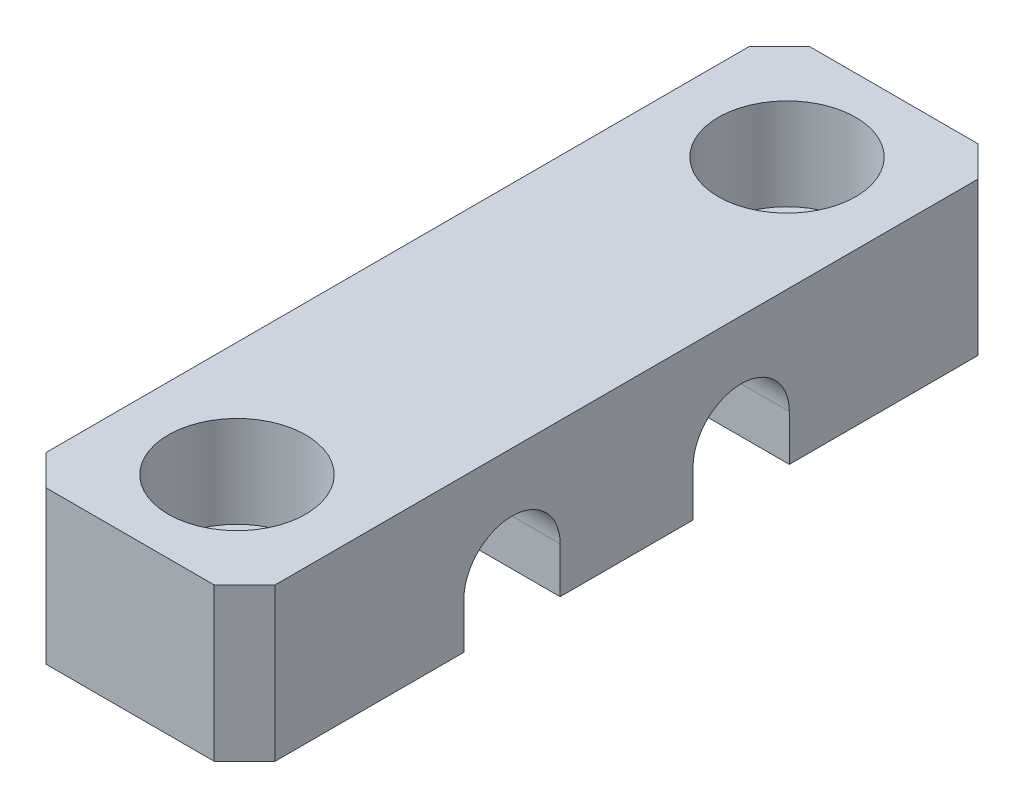
ISO-10303-21;
HEADER;
FILE_DESCRIPTION(('STEP AP214'),'2;1');
FILE_NAME('part.step','',(''),(''),'','','');
FILE_SCHEMA(('AUTOMOTIVE_DESIGN { 1 0 10303 214 1 1 1 1 }'));
ENDSEC;
DATA;
#1=APPLICATION_CONTEXT('core data for automotive mechanical design processes');
#2=APPLICATION_PROTOCOL_DEFINITION('international standard','automotive_design',2000,#1);
#3=PRODUCT_CONTEXT('',#1,'mechanical');
#4=PRODUCT('Part','Part','',(#3));
#5=PRODUCT_RELATED_PRODUCT_CATEGORY('part','',(#4));
#6=PRODUCT_DEFINITION_FORMATION('','',#4);
#7=PRODUCT_DEFINITION_CONTEXT('part definition',#1,'design');
#8=PRODUCT_DEFINITION('design','',#6,#7);
#9=PRODUCT_DEFINITION_SHAPE('','',#8);
#10=(LENGTH_UNIT() NAMED_UNIT(*) SI_UNIT(.MILLI.,.METRE.));
#11=(NAMED_UNIT(*) PLANE_ANGLE_UNIT() SI_UNIT($,.RADIAN.));
#12=(NAMED_UNIT(*) SI_UNIT($,.STERADIAN.) SOLID_ANGLE_UNIT());
#13=UNCERTAINTY_MEASURE_WITH_UNIT(LENGTH_MEASURE(1.E-05),#10,'distance_accuracy_value','');
#14=(GEOMETRIC_REPRESENTATION_CONTEXT(3) GLOBAL_UNCERTAINTY_ASSIGNED_CONTEXT((#13)) GLOBAL_UNIT_ASSIGNED_CONTEXT((#10,
#11,#12)) REPRESENTATION_CONTEXT('',''));
#15=CARTESIAN_POINT('',(0.,0.,0.));
#16=DIRECTION('',(0.,0.,1.));
#17=DIRECTION('',(1.,0.,0.));
#18=AXIS2_PLACEMENT_3D('',#15,#16,#17);
#19=CARTESIAN_POINT('',(15.,-5.,25.));
#20=DIRECTION('',(0.,1.,0.));
#21=DIRECTION('',(0.,0.,1.));
#22=AXIS2_PLACEMENT_3D('',#19,#20,#21);
#23=PLANE('',#22);
#24=CARTESIAN_POINT('',(7.49999999999999,-5.,-18.));
#25=DIRECTION('',(0.,1.,0.));
#26=DIRECTION('',(0.,0.,1.));
#27=AXIS2_PLACEMENT_3D('',#24,#25,#26);
#28=CIRCLE('',#27,3.);
#29=CARTESIAN_POINT('',(7.49999999999999,-5.,-15.));
#30=VERTEX_POINT('',#29);
#31=EDGE_CURVE('E258',#30,#30,#28,.T.);
#32=ORIENTED_EDGE('',*,*,#31,.T.);
#33=EDGE_LOOP('',(#32));
#34=FACE_BOUND('',#33,.T.);
#35=DIRECTION('',(0.,0.,-1.));
#36=VECTOR('',#35,1.);
#37=CARTESIAN_POINT('',(0.,-5.,25.));
#38=LINE('',#37,#36);
#39=CARTESIAN_POINT('',(0.,-5.,-10.65));
#40=VERTEX_POINT('',#39);
#41=CARTESIAN_POINT('',(0.,-5.,-23.));
#42=VERTEX_POINT('',#41);
#43=EDGE_CURVE('E161',#40,#42,#38,.T.);
#44=ORIENTED_EDGE('',*,*,#43,.T.);
#45=DIRECTION('',(-0.707106781186548,0.,0.707106781186548));
#46=VECTOR('',#45,1.);
#47=CARTESIAN_POINT('',(2.,-5.,-25.));
#48=LINE('',#47,#46);
#49=CARTESIAN_POINT('',(2.00000000000001,-5.,-25.));
#50=VERTEX_POINT('',#49);
#51=EDGE_CURVE('E11',#42,#50,#48,.F.);
#52=ORIENTED_EDGE('',*,*,#51,.T.);
#53=DIRECTION('',(-1.,0.,0.));
#54=VECTOR('',#53,1.);
#55=CARTESIAN_POINT('',(15.,-5.,-25.));
#56=LINE('',#55,#54);
#57=CARTESIAN_POINT('',(13.,-5.,-25.));
#58=VERTEX_POINT('',#57);
#59=EDGE_CURVE('E197',#58,#50,#56,.T.);
#60=ORIENTED_EDGE('',*,*,#59,.F.);
#61=DIRECTION('',(0.707106781186548,0.,0.707106781186548));
#62=VECTOR('',#61,1.);
#63=CARTESIAN_POINT('',(15.,-5.,-23.));
#64=LINE('',#63,#62);
#65=CARTESIAN_POINT('',(15.,-5.,-23.));
#66=VERTEX_POINT('',#65);
#67=EDGE_CURVE('E42',#58,#66,#64,.T.);
#68=ORIENTED_EDGE('',*,*,#67,.T.);
#69=DIRECTION('',(0.,0.,-1.));
#70=VECTOR('',#69,1.);
#71=CARTESIAN_POINT('',(15.,-5.,25.));
#72=LINE('',#71,#70);
#73=CARTESIAN_POINT('',(15.,-5.,-10.65));
#74=VERTEX_POINT('',#73);
#75=EDGE_CURVE('E163',#74,#66,#72,.T.);
#76=ORIENTED_EDGE('',*,*,#75,.F.);
#77=DIRECTION('',(1.,0.,0.));
#78=VECTOR('',#77,1.);
#79=CARTESIAN_POINT('',(0.,-5.,-10.65));
#80=LINE('',#79,#78);
#81=EDGE_CURVE('E151',#40,#74,#80,.T.);
#82=ORIENTED_EDGE('',*,*,#81,.F.);
#83=EDGE_LOOP('',(#44,#52,#60,#68,#76,#82));
#84=FACE_BOUND('',#83,.T.);
#85=ADVANCED_FACE('F34',(#34,#84),#23,.F.);
#86=CARTESIAN_POINT('',(0.,-5.,4.35));
#87=VERTEX_POINT('',#86);
#88=CARTESIAN_POINT('',(0.,-5.,-4.35));
#89=VERTEX_POINT('',#88);
#90=EDGE_CURVE('E171',#87,#89,#38,.T.);
#91=ORIENTED_EDGE('',*,*,#90,.T.);
#92=DIRECTION('',(1.,0.,0.));
#93=VECTOR('',#92,1.);
#94=CARTESIAN_POINT('',(0.,-5.,-4.35));
#95=LINE('',#94,#93);
#96=CARTESIAN_POINT('',(15.,-5.,-4.35));
#97=VERTEX_POINT('',#96);
#98=EDGE_CURVE('E217',#89,#97,#95,.T.);
#99=ORIENTED_EDGE('',*,*,#98,.T.);
#100=CARTESIAN_POINT('',(15.,-5.,4.35));
#101=VERTEX_POINT('',#100);
#102=EDGE_CURVE('E191',#101,#97,#72,.T.);
#103=ORIENTED_EDGE('',*,*,#102,.F.);
#104=DIRECTION('',(1.,0.,0.));
#105=VECTOR('',#104,1.);
#106=CARTESIAN_POINT('',(15.,-5.,4.35));
#107=LINE('',#106,#105);
#108=EDGE_CURVE('E215',#87,#101,#107,.T.);
#109=ORIENTED_EDGE('',*,*,#108,.F.);
#110=EDGE_LOOP('',(#91,#99,#103,#109));
#111=FACE_BOUND('',#110,.T.);
#112=ADVANCED_FACE('F214',(#111),#23,.F.);
#113=CARTESIAN_POINT('',(7.5,-5.,18.));
#114=DIRECTION('',(0.,1.,0.));
#115=DIRECTION('',(0.,0.,1.));
#116=AXIS2_PLACEMENT_3D('',#113,#114,#115);
#117=CIRCLE('',#116,3.);
#118=CARTESIAN_POINT('',(7.5,-5.,21.));
#119=VERTEX_POINT('',#118);
#120=EDGE_CURVE('E252',#119,#119,#117,.T.);
#121=ORIENTED_EDGE('',*,*,#120,.T.);
#122=EDGE_LOOP('',(#121));
#123=FACE_BOUND('',#122,.T.);
#124=DIRECTION('',(-1.,0.,0.));
#125=VECTOR('',#124,1.);
#126=CARTESIAN_POINT('',(15.,-5.,25.));
#127=LINE('',#126,#125);
#128=CARTESIAN_POINT('',(13.,-5.,25.));
#129=VERTEX_POINT('',#128);
#130=CARTESIAN_POINT('',(2.00000000000001,-5.,25.));
#131=VERTEX_POINT('',#130);
#132=EDGE_CURVE('E201',#129,#131,#127,.T.);
#133=ORIENTED_EDGE('',*,*,#132,.T.);
#134=DIRECTION('',(0.707106781186548,0.,0.707106781186548));
#135=VECTOR('',#134,1.);
#136=CARTESIAN_POINT('',(2.,-5.,25.));
#137=LINE('',#136,#135);
#138=CARTESIAN_POINT('',(0.,-5.,23.));
#139=VERTEX_POINT('',#138);
#140=EDGE_CURVE('E315',#131,#139,#137,.F.);
#141=ORIENTED_EDGE('',*,*,#140,.T.);
#142=CARTESIAN_POINT('',(0.,-5.,10.65));
#143=VERTEX_POINT('',#142);
#144=EDGE_CURVE('E174',#139,#143,#38,.T.);
#145=ORIENTED_EDGE('',*,*,#144,.T.);
#146=DIRECTION('',(1.,0.,0.));
#147=VECTOR('',#146,1.);
#148=CARTESIAN_POINT('',(15.,-5.,10.65));
#149=LINE('',#148,#147);
#150=CARTESIAN_POINT('',(15.,-5.,10.65));
#151=VERTEX_POINT('',#150);
#152=EDGE_CURVE('E245',#143,#151,#149,.T.);
#153=ORIENTED_EDGE('',*,*,#152,.T.);
#154=CARTESIAN_POINT('',(15.,-5.,23.));
#155=VERTEX_POINT('',#154);
#156=EDGE_CURVE('E193',#155,#151,#72,.T.);
#157=ORIENTED_EDGE('',*,*,#156,.F.);
#158=DIRECTION('',(-0.707106781186548,0.,0.707106781186548));
#159=VECTOR('',#158,1.);
#160=CARTESIAN_POINT('',(15.,-5.,23.));
#161=LINE('',#160,#159);
#162=EDGE_CURVE('E317',#155,#129,#161,.T.);
#163=ORIENTED_EDGE('',*,*,#162,.T.);
#164=EDGE_LOOP('',(#133,#141,#145,#153,#157,#163));
#165=FACE_BOUND('',#164,.T.);
#166=ADVANCED_FACE('F328',(#123,#165),#23,.F.);
#167=CARTESIAN_POINT('',(15.,0.,0.));
#168=DIRECTION('',(1.,0.,0.));
#169=DIRECTION('',(0.,0.,-1.));
#170=AXIS2_PLACEMENT_3D('',#167,#168,#169);
#171=PLANE('',#170);
#172=DIRECTION('',(0.,0.,1.));
#173=VECTOR('',#172,1.);
#174=CARTESIAN_POINT('',(15.,5.,25.));
#175=LINE('',#174,#173);
#176=CARTESIAN_POINT('',(15.,5.,-23.));
#177=VERTEX_POINT('',#176);
#178=CARTESIAN_POINT('',(15.,5.,23.));
#179=VERTEX_POINT('',#178);
#180=EDGE_CURVE('E180',#177,#179,#175,.T.);
#181=ORIENTED_EDGE('',*,*,#180,.T.);
#182=DIRECTION('',(0.,-1.,0.));
#183=VECTOR('',#182,1.);
#184=CARTESIAN_POINT('',(15.,-5.,23.));
#185=LINE('',#184,#183);
#186=EDGE_CURVE('E297',#179,#155,#185,.T.);
#187=ORIENTED_EDGE('',*,*,#186,.T.);
#188=ORIENTED_EDGE('',*,*,#156,.T.);
#189=DIRECTION('',(0.,-1.,0.));
#190=VECTOR('',#189,1.);
#191=CARTESIAN_POINT('',(15.,0.,10.65));
#192=LINE('',#191,#190);
#193=CARTESIAN_POINT('',(15.,-2.,10.65));
#194=VERTEX_POINT('',#193);
#195=EDGE_CURVE('E233',#194,#151,#192,.T.);
#196=ORIENTED_EDGE('',*,*,#195,.F.);
#197=CARTESIAN_POINT('',(15.,-2.,7.5));
#198=DIRECTION('',(1.,0.,0.));
#199=DIRECTION('',(0.,0.,-1.));
#200=AXIS2_PLACEMENT_3D('',#197,#198,#199);
#201=CIRCLE('',#200,3.15);
#202=CARTESIAN_POINT('',(15.,-2.,4.35));
#203=VERTEX_POINT('',#202);
#204=EDGE_CURVE('E223',#203,#194,#201,.T.);
#205=ORIENTED_EDGE('',*,*,#204,.F.);
#206=DIRECTION('',(0.,-1.,0.));
#207=VECTOR('',#206,1.);
#208=CARTESIAN_POINT('',(15.,0.,4.35));
#209=LINE('',#208,#207);
#210=EDGE_CURVE('E210',#203,#101,#209,.T.);
#211=ORIENTED_EDGE('',*,*,#210,.T.);
#212=ORIENTED_EDGE('',*,*,#102,.T.);
#213=DIRECTION('',(0.,-1.,0.));
#214=VECTOR('',#213,1.);
#215=CARTESIAN_POINT('',(15.,0.,-4.35));
#216=LINE('',#215,#214);
#217=CARTESIAN_POINT('',(15.,-2.,-4.35));
#218=VERTEX_POINT('',#217);
#219=EDGE_CURVE('E158',#218,#97,#216,.T.);
#220=ORIENTED_EDGE('',*,*,#219,.F.);
#221=CARTESIAN_POINT('',(15.,-2.,-7.5));
#222=DIRECTION('',(1.,0.,0.));
#223=DIRECTION('',(0.,0.,-1.));
#224=AXIS2_PLACEMENT_3D('',#221,#222,#223);
#225=CIRCLE('',#224,3.15);
#226=CARTESIAN_POINT('',(15.,-2.,-10.65));
#227=VERTEX_POINT('',#226);
#228=EDGE_CURVE('E558',#227,#218,#225,.T.);
#229=ORIENTED_EDGE('',*,*,#228,.F.);
#230=DIRECTION('',(0.,-1.,0.));
#231=VECTOR('',#230,1.);
#232=CARTESIAN_POINT('',(15.,0.,-10.65));
#233=LINE('',#232,#231);
#234=EDGE_CURVE('E309',#227,#74,#233,.T.);
#235=ORIENTED_EDGE('',*,*,#234,.T.);
#236=ORIENTED_EDGE('',*,*,#75,.T.);
#237=DIRECTION('',(0.,1.,0.));
#238=VECTOR('',#237,1.);
#239=CARTESIAN_POINT('',(15.,5.,-23.));
#240=LINE('',#239,#238);
#241=EDGE_CURVE('E294',#66,#177,#240,.T.);
#242=ORIENTED_EDGE('',*,*,#241,.T.);
#243=EDGE_LOOP('',(#181,#187,#188,#196,#205,#211,#212,#220,#229,#235,#236,#242));
#244=FACE_BOUND('',#243,.T.);
#245=ADVANCED_FACE('F206',(#244),#171,.T.);
#246=CARTESIAN_POINT('',(0.,0.,0.));
#247=DIRECTION('',(1.,0.,0.));
#248=DIRECTION('',(0.,0.,-1.));
#249=AXIS2_PLACEMENT_3D('',#246,#247,#248);
#250=PLANE('',#249);
#251=ORIENTED_EDGE('',*,*,#144,.F.);
#252=DIRECTION('',(0.,1.,0.));
#253=VECTOR('',#252,1.);
#254=CARTESIAN_POINT('',(0.,0.,23.));
#255=LINE('',#254,#253);
#256=CARTESIAN_POINT('',(0.,5.,23.));
#257=VERTEX_POINT('',#256);
#258=EDGE_CURVE('E291',#139,#257,#255,.T.);
#259=ORIENTED_EDGE('',*,*,#258,.T.);
#260=DIRECTION('',(0.,0.,1.));
#261=VECTOR('',#260,1.);
#262=CARTESIAN_POINT('',(0.,5.,25.));
#263=LINE('',#262,#261);
#264=CARTESIAN_POINT('',(0.,5.,-23.));
#265=VERTEX_POINT('',#264);
#266=EDGE_CURVE('E172',#265,#257,#263,.T.);
#267=ORIENTED_EDGE('',*,*,#266,.F.);
#268=DIRECTION('',(0.,-1.,0.));
#269=VECTOR('',#268,1.);
#270=CARTESIAN_POINT('',(0.,0.,-23.));
#271=LINE('',#270,#269);
#272=EDGE_CURVE('E170',#265,#42,#271,.T.);
#273=ORIENTED_EDGE('',*,*,#272,.T.);
#274=ORIENTED_EDGE('',*,*,#43,.F.);
#275=DIRECTION('',(0.,-1.,0.));
#276=VECTOR('',#275,1.);
#277=CARTESIAN_POINT('',(0.,0.,-10.65));
#278=LINE('',#277,#276);
#279=CARTESIAN_POINT('',(0.,-2.,-10.65));
#280=VERTEX_POINT('',#279);
#281=EDGE_CURVE('E147',#280,#40,#278,.T.);
#282=ORIENTED_EDGE('',*,*,#281,.F.);
#283=CARTESIAN_POINT('',(0.,-2.,-7.5));
#284=DIRECTION('',(1.,0.,0.));
#285=DIRECTION('',(0.,0.,-1.));
#286=AXIS2_PLACEMENT_3D('',#283,#284,#285);
#287=CIRCLE('',#286,3.15);
#288=CARTESIAN_POINT('',(0.,-2.,-4.35));
#289=VERTEX_POINT('',#288);
#290=EDGE_CURVE('E157',#280,#289,#287,.T.);
#291=ORIENTED_EDGE('',*,*,#290,.T.);
#292=DIRECTION('',(0.,-1.,0.));
#293=VECTOR('',#292,1.);
#294=CARTESIAN_POINT('',(0.,0.,-4.35));
#295=LINE('',#294,#293);
#296=EDGE_CURVE('E164',#289,#89,#295,.T.);
#297=ORIENTED_EDGE('',*,*,#296,.T.);
#298=ORIENTED_EDGE('',*,*,#90,.F.);
#299=DIRECTION('',(0.,-1.,0.));
#300=VECTOR('',#299,1.);
#301=CARTESIAN_POINT('',(0.,0.,4.35));
#302=LINE('',#301,#300);
#303=CARTESIAN_POINT('',(0.,-2.,4.35));
#304=VERTEX_POINT('',#303);
#305=EDGE_CURVE('E230',#304,#87,#302,.T.);
#306=ORIENTED_EDGE('',*,*,#305,.F.);
#307=CARTESIAN_POINT('',(0.,-2.,7.5));
#308=DIRECTION('',(1.,0.,0.));
#309=DIRECTION('',(0.,0.,-1.));
#310=AXIS2_PLACEMENT_3D('',#307,#308,#309);
#311=CIRCLE('',#310,3.15);
#312=CARTESIAN_POINT('',(0.,-2.,10.65));
#313=VERTEX_POINT('',#312);
#314=EDGE_CURVE('E232',#304,#313,#311,.T.);
#315=ORIENTED_EDGE('',*,*,#314,.T.);
#316=DIRECTION('',(0.,-1.,0.));
#317=VECTOR('',#316,1.);
#318=CARTESIAN_POINT('',(0.,0.,10.65));
#319=LINE('',#318,#317);
#320=EDGE_CURVE('E236',#313,#143,#319,.T.);
#321=ORIENTED_EDGE('',*,*,#320,.T.);
#322=EDGE_LOOP('',(#251,#259,#267,#273,#274,#282,#291,#297,#298,#306,#315,#321));
#323=FACE_BOUND('',#322,.T.);
#324=ADVANCED_FACE('F167',(#323),#250,.F.);
#325=CARTESIAN_POINT('',(15.,5.,-25.));
#326=DIRECTION('',(0.,0.,1.));
#327=DIRECTION('',(1.,0.,0.));
#328=AXIS2_PLACEMENT_3D('',#325,#326,#327);
#329=PLANE('',#328);
#330=ORIENTED_EDGE('',*,*,#59,.T.);
#331=DIRECTION('',(0.,1.,0.));
#332=VECTOR('',#331,1.);
#333=CARTESIAN_POINT('',(2.,5.,-25.));
#334=LINE('',#333,#332);
#335=CARTESIAN_POINT('',(2.00000000000001,5.,-25.));
#336=VERTEX_POINT('',#335);
#337=EDGE_CURVE('E304',#50,#336,#334,.T.);
#338=ORIENTED_EDGE('',*,*,#337,.T.);
#339=DIRECTION('',(-1.,0.,0.));
#340=VECTOR('',#339,1.);
#341=CARTESIAN_POINT('',(15.,5.,-25.));
#342=LINE('',#341,#340);
#343=CARTESIAN_POINT('',(13.,5.,-25.));
#344=VERTEX_POINT('',#343);
#345=EDGE_CURVE('E322',#344,#336,#342,.T.);
#346=ORIENTED_EDGE('',*,*,#345,.F.);
#347=DIRECTION('',(0.,-1.,0.));
#348=VECTOR('',#347,1.);
#349=CARTESIAN_POINT('',(13.,-5.,-25.));
#350=LINE('',#349,#348);
#351=EDGE_CURVE('E54',#344,#58,#350,.T.);
#352=ORIENTED_EDGE('',*,*,#351,.T.);
#353=EDGE_LOOP('',(#330,#338,#346,#352));
#354=FACE_BOUND('',#353,.T.);
#355=ADVANCED_FACE('F278',(#354),#329,.F.);
#356=CARTESIAN_POINT('',(15.,5.,25.));
#357=DIRECTION('',(0.,-1.,0.));
#358=DIRECTION('',(0.,0.,-1.));
#359=AXIS2_PLACEMENT_3D('',#356,#357,#358);
#360=PLANE('',#359);
#361=CARTESIAN_POINT('',(7.49999999999999,5.,-18.));
#362=DIRECTION('',(0.,1.,0.));
#363=DIRECTION('',(0.,0.,1.));
#364=AXIS2_PLACEMENT_3D('',#361,#362,#363);
#365=CIRCLE('',#364,4.5);
#366=CARTESIAN_POINT('',(7.49999999999999,5.,-13.5));
#367=VERTEX_POINT('',#366);
#368=EDGE_CURVE('E261',#367,#367,#365,.T.);
#369=ORIENTED_EDGE('',*,*,#368,.F.);
#370=EDGE_LOOP('',(#369));
#371=FACE_BOUND('',#370,.T.);
#372=CARTESIAN_POINT('',(7.5,5.,18.));
#373=DIRECTION('',(0.,1.,0.));
#374=DIRECTION('',(0.,0.,1.));
#375=AXIS2_PLACEMENT_3D('',#372,#373,#374);
#376=CIRCLE('',#375,4.5);
#377=CARTESIAN_POINT('',(7.5,5.,22.5));
#378=VERTEX_POINT('',#377);
#379=EDGE_CURVE('E195',#378,#378,#376,.T.);
#380=ORIENTED_EDGE('',*,*,#379,.F.);
#381=EDGE_LOOP('',(#380));
#382=FACE_BOUND('',#381,.T.);
#383=ORIENTED_EDGE('',*,*,#266,.T.);
#384=DIRECTION('',(-0.707106781186548,0.,-0.707106781186548));
#385=VECTOR('',#384,1.);
#386=CARTESIAN_POINT('',(2.,5.,25.));
#387=LINE('',#386,#385);
#388=CARTESIAN_POINT('',(2.00000000000001,5.,25.));
#389=VERTEX_POINT('',#388);
#390=EDGE_CURVE('E283',#257,#389,#387,.F.);
#391=ORIENTED_EDGE('',*,*,#390,.T.);
#392=DIRECTION('',(-1.,0.,0.));
#393=VECTOR('',#392,1.);
#394=CARTESIAN_POINT('',(15.,5.,25.));
#395=LINE('',#394,#393);
#396=CARTESIAN_POINT('',(13.,5.,25.));
#397=VERTEX_POINT('',#396);
#398=EDGE_CURVE('E324',#397,#389,#395,.T.);
#399=ORIENTED_EDGE('',*,*,#398,.F.);
#400=DIRECTION('',(0.707106781186548,0.,-0.707106781186548));
#401=VECTOR('',#400,1.);
#402=CARTESIAN_POINT('',(15.,5.,23.));
#403=LINE('',#402,#401);
#404=EDGE_CURVE('E295',#397,#179,#403,.T.);
#405=ORIENTED_EDGE('',*,*,#404,.T.);
#406=ORIENTED_EDGE('',*,*,#180,.F.);
#407=DIRECTION('',(-0.707106781186548,0.,-0.707106781186548));
#408=VECTOR('',#407,1.);
#409=CARTESIAN_POINT('',(15.,5.,-23.));
#410=LINE('',#409,#408);
#411=EDGE_CURVE('E310',#177,#344,#410,.T.);
#412=ORIENTED_EDGE('',*,*,#411,.T.);
#413=ORIENTED_EDGE('',*,*,#345,.T.);
#414=DIRECTION('',(0.707106781186548,0.,-0.707106781186548));
#415=VECTOR('',#414,1.);
#416=CARTESIAN_POINT('',(2.,5.,-25.));
#417=LINE('',#416,#415);
#418=EDGE_CURVE('E286',#336,#265,#417,.F.);
#419=ORIENTED_EDGE('',*,*,#418,.T.);
#420=EDGE_LOOP('',(#383,#391,#399,#405,#406,#412,#413,#419));
#421=FACE_BOUND('',#420,.T.);
#422=ADVANCED_FACE('F274',(#371,#382,#421),#360,.F.);
#423=CARTESIAN_POINT('',(15.,5.,25.));
#424=DIRECTION('',(0.,0.,-1.));
#425=DIRECTION('',(-1.,0.,0.));
#426=AXIS2_PLACEMENT_3D('',#423,#424,#425);
#427=PLANE('',#426);
#428=ORIENTED_EDGE('',*,*,#398,.T.);
#429=DIRECTION('',(0.,-1.,0.));
#430=VECTOR('',#429,1.);
#431=CARTESIAN_POINT('',(2.,5.,25.));
#432=LINE('',#431,#430);
#433=EDGE_CURVE('E293',#389,#131,#432,.T.);
#434=ORIENTED_EDGE('',*,*,#433,.T.);
#435=ORIENTED_EDGE('',*,*,#132,.F.);
#436=DIRECTION('',(0.,1.,0.));
#437=VECTOR('',#436,1.);
#438=CARTESIAN_POINT('',(13.,5.,25.));
#439=LINE('',#438,#437);
#440=EDGE_CURVE('E320',#129,#397,#439,.T.);
#441=ORIENTED_EDGE('',*,*,#440,.T.);
#442=EDGE_LOOP('',(#428,#434,#435,#441));
#443=FACE_BOUND('',#442,.T.);
#444=ADVANCED_FACE('F277',(#443),#427,.F.);
#445=CARTESIAN_POINT('',(7.5,-1.,18.));
#446=DIRECTION('',(0.,1.,0.));
#447=DIRECTION('',(0.,0.,1.));
#448=AXIS2_PLACEMENT_3D('',#445,#446,#447);
#449=CYLINDRICAL_SURFACE('',#448,4.5);
#450=CARTESIAN_POINT('',(7.5,-1.,18.));
#451=DIRECTION('',(0.,1.,0.));
#452=DIRECTION('',(0.,0.,1.));
#453=AXIS2_PLACEMENT_3D('',#450,#451,#452);
#454=CIRCLE('',#453,4.5);
#455=CARTESIAN_POINT('',(7.5,-1.,22.5));
#456=VERTEX_POINT('',#455);
#457=EDGE_CURVE('E177',#456,#456,#454,.T.);
#458=ORIENTED_EDGE('',*,*,#457,.F.);
#459=EDGE_LOOP('',(#458));
#460=FACE_BOUND('',#459,.T.);
#461=ORIENTED_EDGE('',*,*,#379,.T.);
#462=EDGE_LOOP('',(#461));
#463=FACE_BOUND('',#462,.T.);
#464=ADVANCED_FACE('F272',(#460,#463),#449,.F.);
#465=CARTESIAN_POINT('',(7.5,-1.,18.));
#466=DIRECTION('',(0.,1.,0.));
#467=DIRECTION('',(0.,0.,1.));
#468=AXIS2_PLACEMENT_3D('',#465,#466,#467);
#469=PLANE('',#468);
#470=CARTESIAN_POINT('',(7.5,-1.,18.));
#471=DIRECTION('',(0.,1.,0.));
#472=DIRECTION('',(0.,0.,1.));
#473=AXIS2_PLACEMENT_3D('',#470,#471,#472);
#474=CIRCLE('',#473,3.);
#475=CARTESIAN_POINT('',(7.5,-1.,21.));
#476=VERTEX_POINT('',#475);
#477=EDGE_CURVE('E249',#476,#476,#474,.T.);
#478=ORIENTED_EDGE('',*,*,#477,.F.);
#479=EDGE_LOOP('',(#478));
#480=FACE_BOUND('',#479,.T.);
#481=ORIENTED_EDGE('',*,*,#457,.T.);
#482=EDGE_LOOP('',(#481));
#483=FACE_BOUND('',#482,.T.);
#484=ADVANCED_FACE('F377',(#480,#483),#469,.T.);
#485=CARTESIAN_POINT('',(7.49999999999999,-1.,-18.));
#486=DIRECTION('',(0.,1.,0.));
#487=DIRECTION('',(0.,0.,1.));
#488=AXIS2_PLACEMENT_3D('',#485,#486,#487);
#489=CYLINDRICAL_SURFACE('',#488,4.5);
#490=CARTESIAN_POINT('',(7.49999999999999,-1.,-18.));
#491=DIRECTION('',(0.,1.,0.));
#492=DIRECTION('',(0.,0.,1.));
#493=AXIS2_PLACEMENT_3D('',#490,#491,#492);
#494=CIRCLE('',#493,4.5);
#495=CARTESIAN_POINT('',(7.49999999999999,-1.,-13.5));
#496=VERTEX_POINT('',#495);
#497=EDGE_CURVE('E262',#496,#496,#494,.T.);
#498=ORIENTED_EDGE('',*,*,#497,.F.);
#499=EDGE_LOOP('',(#498));
#500=FACE_BOUND('',#499,.T.);
#501=ORIENTED_EDGE('',*,*,#368,.T.);
#502=EDGE_LOOP('',(#501));
#503=FACE_BOUND('',#502,.T.);
#504=ADVANCED_FACE('F381',(#500,#503),#489,.F.);
#505=CARTESIAN_POINT('',(7.49999999999999,-1.,-18.));
#506=DIRECTION('',(0.,1.,0.));
#507=DIRECTION('',(0.,0.,1.));
#508=AXIS2_PLACEMENT_3D('',#505,#506,#507);
#509=PLANE('',#508);
#510=CARTESIAN_POINT('',(7.49999999999999,-1.,-18.));
#511=DIRECTION('',(0.,1.,0.));
#512=DIRECTION('',(0.,0.,1.));
#513=AXIS2_PLACEMENT_3D('',#510,#511,#512);
#514=CIRCLE('',#513,3.);
#515=CARTESIAN_POINT('',(7.49999999999999,-1.,-15.));
#516=VERTEX_POINT('',#515);
#517=EDGE_CURVE('E255',#516,#516,#514,.T.);
#518=ORIENTED_EDGE('',*,*,#517,.F.);
#519=EDGE_LOOP('',(#518));
#520=FACE_BOUND('',#519,.T.);
#521=ORIENTED_EDGE('',*,*,#497,.T.);
#522=EDGE_LOOP('',(#521));
#523=FACE_BOUND('',#522,.T.);
#524=ADVANCED_FACE('F385',(#520,#523),#509,.T.);
#525=CARTESIAN_POINT('',(7.49999999999999,-7.,-18.));
#526=DIRECTION('',(0.,1.,0.));
#527=DIRECTION('',(0.,0.,1.));
#528=AXIS2_PLACEMENT_3D('',#525,#526,#527);
#529=CYLINDRICAL_SURFACE('',#528,3.);
#530=ORIENTED_EDGE('',*,*,#517,.T.);
#531=EDGE_LOOP('',(#530));
#532=FACE_BOUND('',#531,.T.);
#533=ORIENTED_EDGE('',*,*,#31,.F.);
#534=EDGE_LOOP('',(#533));
#535=FACE_BOUND('',#534,.T.);
#536=ADVANCED_FACE('F351',(#532,#535),#529,.F.);
#537=CARTESIAN_POINT('',(7.5,-7.,18.));
#538=DIRECTION('',(0.,1.,0.));
#539=DIRECTION('',(0.,0.,1.));
#540=AXIS2_PLACEMENT_3D('',#537,#538,#539);
#541=CYLINDRICAL_SURFACE('',#540,3.);
#542=ORIENTED_EDGE('',*,*,#477,.T.);
#543=EDGE_LOOP('',(#542));
#544=FACE_BOUND('',#543,.T.);
#545=ORIENTED_EDGE('',*,*,#120,.F.);
#546=EDGE_LOOP('',(#545));
#547=FACE_BOUND('',#546,.T.);
#548=ADVANCED_FACE('F344',(#544,#547),#541,.F.);
#549=CARTESIAN_POINT('',(0.,0.,4.35));
#550=DIRECTION('',(0.,0.,1.));
#551=DIRECTION('',(0.,-1.,0.));
#552=AXIS2_PLACEMENT_3D('',#549,#550,#551);
#553=PLANE('',#552);
#554=ORIENTED_EDGE('',*,*,#108,.T.);
#555=ORIENTED_EDGE('',*,*,#210,.F.);
#556=DIRECTION('',(1.,0.,0.));
#557=VECTOR('',#556,1.);
#558=CARTESIAN_POINT('',(0.,-2.,4.35));
#559=LINE('',#558,#557);
#560=EDGE_CURVE('E238',#304,#203,#559,.T.);
#561=ORIENTED_EDGE('',*,*,#560,.F.);
#562=ORIENTED_EDGE('',*,*,#305,.T.);
#563=EDGE_LOOP('',(#554,#555,#561,#562));
#564=FACE_BOUND('',#563,.T.);
#565=ADVANCED_FACE('F342',(#564),#553,.T.);
#566=CARTESIAN_POINT('',(0.,0.,10.65));
#567=DIRECTION('',(0.,0.,1.));
#568=DIRECTION('',(1.,0.,0.));
#569=AXIS2_PLACEMENT_3D('',#566,#567,#568);
#570=PLANE('',#569);
#571=ORIENTED_EDGE('',*,*,#320,.F.);
#572=DIRECTION('',(1.,0.,0.));
#573=VECTOR('',#572,1.);
#574=CARTESIAN_POINT('',(0.,-2.,10.65));
#575=LINE('',#574,#573);
#576=EDGE_CURVE('E243',#313,#194,#575,.T.);
#577=ORIENTED_EDGE('',*,*,#576,.T.);
#578=ORIENTED_EDGE('',*,*,#195,.T.);
#579=ORIENTED_EDGE('',*,*,#152,.F.);
#580=EDGE_LOOP('',(#571,#577,#578,#579));
#581=FACE_BOUND('',#580,.T.);
#582=ADVANCED_FACE('F335',(#581),#570,.F.);
#583=CARTESIAN_POINT('',(0.,-2.,7.5));
#584=DIRECTION('',(1.,0.,0.));
#585=DIRECTION('',(0.,0.,-1.));
#586=AXIS2_PLACEMENT_3D('',#583,#584,#585);
#587=CYLINDRICAL_SURFACE('',#586,3.15);
#588=ORIENTED_EDGE('',*,*,#204,.T.);
#589=ORIENTED_EDGE('',*,*,#576,.F.);
#590=ORIENTED_EDGE('',*,*,#314,.F.);
#591=ORIENTED_EDGE('',*,*,#560,.T.);
#592=EDGE_LOOP('',(#588,#589,#590,#591));
#593=FACE_BOUND('',#592,.T.);
#594=ADVANCED_FACE('F340',(#593),#587,.F.);
#595=CARTESIAN_POINT('',(0.,0.,-4.35));
#596=DIRECTION('',(0.,0.,1.));
#597=DIRECTION('',(1.,0.,0.));
#598=AXIS2_PLACEMENT_3D('',#595,#596,#597);
#599=PLANE('',#598);
#600=ORIENTED_EDGE('',*,*,#219,.T.);
#601=ORIENTED_EDGE('',*,*,#98,.F.);
#602=ORIENTED_EDGE('',*,*,#296,.F.);
#603=DIRECTION('',(1.,0.,0.));
#604=VECTOR('',#603,1.);
#605=CARTESIAN_POINT('',(0.,-2.,-4.35));
#606=LINE('',#605,#604);
#607=EDGE_CURVE('E221',#289,#218,#606,.T.);
#608=ORIENTED_EDGE('',*,*,#607,.T.);
#609=EDGE_LOOP('',(#600,#601,#602,#608));
#610=FACE_BOUND('',#609,.T.);
#611=ADVANCED_FACE('F435',(#610),#599,.F.);
#612=CARTESIAN_POINT('',(0.,-2.,-7.5));
#613=DIRECTION('',(1.,0.,0.));
#614=DIRECTION('',(0.,0.,-1.));
#615=AXIS2_PLACEMENT_3D('',#612,#613,#614);
#616=CYLINDRICAL_SURFACE('',#615,3.15);
#617=ORIENTED_EDGE('',*,*,#228,.T.);
#618=ORIENTED_EDGE('',*,*,#607,.F.);
#619=ORIENTED_EDGE('',*,*,#290,.F.);
#620=DIRECTION('',(1.,0.,0.));
#621=VECTOR('',#620,1.);
#622=CARTESIAN_POINT('',(0.,-2.,-10.65));
#623=LINE('',#622,#621);
#624=EDGE_CURVE('E153',#280,#227,#623,.T.);
#625=ORIENTED_EDGE('',*,*,#624,.T.);
#626=EDGE_LOOP('',(#617,#618,#619,#625));
#627=FACE_BOUND('',#626,.T.);
#628=ADVANCED_FACE('F443',(#627),#616,.F.);
#629=CARTESIAN_POINT('',(0.,0.,-10.65));
#630=DIRECTION('',(0.,0.,1.));
#631=DIRECTION('',(1.,0.,0.));
#632=AXIS2_PLACEMENT_3D('',#629,#630,#631);
#633=PLANE('',#632);
#634=ORIENTED_EDGE('',*,*,#234,.F.);
#635=ORIENTED_EDGE('',*,*,#624,.F.);
#636=ORIENTED_EDGE('',*,*,#281,.T.);
#637=ORIENTED_EDGE('',*,*,#81,.T.);
#638=EDGE_LOOP('',(#634,#635,#636,#637));
#639=FACE_BOUND('',#638,.T.);
#640=ADVANCED_FACE('F150',(#639),#633,.T.);
#641=CARTESIAN_POINT('',(2.,5.,25.));
#642=DIRECTION('',(0.707106781186547,0.,-0.707106781186547));
#643=DIRECTION('',(0.,-1.,0.));
#644=AXIS2_PLACEMENT_3D('',#641,#642,#643);
#645=PLANE('',#644);
#646=ORIENTED_EDGE('',*,*,#390,.F.);
#647=ORIENTED_EDGE('',*,*,#258,.F.);
#648=ORIENTED_EDGE('',*,*,#140,.F.);
#649=ORIENTED_EDGE('',*,*,#433,.F.);
#650=EDGE_LOOP('',(#646,#647,#648,#649));
#651=FACE_BOUND('',#650,.T.);
#652=ADVANCED_FACE('F290',(#651),#645,.F.);
#653=CARTESIAN_POINT('',(15.,0.,23.));
#654=DIRECTION('',(0.707106781186547,0.,0.707106781186547));
#655=DIRECTION('',(0.,1.,0.));
#656=AXIS2_PLACEMENT_3D('',#653,#654,#655);
#657=PLANE('',#656);
#658=ORIENTED_EDGE('',*,*,#404,.F.);
#659=ORIENTED_EDGE('',*,*,#440,.F.);
#660=ORIENTED_EDGE('',*,*,#162,.F.);
#661=ORIENTED_EDGE('',*,*,#186,.F.);
#662=EDGE_LOOP('',(#658,#659,#660,#661));
#663=FACE_BOUND('',#662,.T.);
#664=ADVANCED_FACE('F333',(#663),#657,.T.);
#665=CARTESIAN_POINT('',(2.,5.,-25.));
#666=DIRECTION('',(0.707106781186547,0.,0.707106781186547));
#667=DIRECTION('',(0.,1.,0.));
#668=AXIS2_PLACEMENT_3D('',#665,#666,#667);
#669=PLANE('',#668);
#670=ORIENTED_EDGE('',*,*,#51,.F.);
#671=ORIENTED_EDGE('',*,*,#272,.F.);
#672=ORIENTED_EDGE('',*,*,#418,.F.);
#673=ORIENTED_EDGE('',*,*,#337,.F.);
#674=EDGE_LOOP('',(#670,#671,#672,#673));
#675=FACE_BOUND('',#674,.T.);
#676=ADVANCED_FACE('F514',(#675),#669,.F.);
#677=CARTESIAN_POINT('',(15.,0.,-23.));
#678=DIRECTION('',(0.707106781186547,0.,-0.707106781186547));
#679=DIRECTION('',(0.,-1.,0.));
#680=AXIS2_PLACEMENT_3D('',#677,#678,#679);
#681=PLANE('',#680);
#682=ORIENTED_EDGE('',*,*,#67,.F.);
#683=ORIENTED_EDGE('',*,*,#351,.F.);
#684=ORIENTED_EDGE('',*,*,#411,.F.);
#685=ORIENTED_EDGE('',*,*,#241,.F.);
#686=EDGE_LOOP('',(#682,#683,#684,#685));
#687=FACE_BOUND('',#686,.T.);
#688=ADVANCED_FACE('F36',(#687),#681,.T.);
#689=CLOSED_SHELL('',(#85,#112,#166,#245,#324,#355,#422,#444,#464,#484,#504,#524,#536,#548,#565,
#582,#594,#611,#628,#640,#652,#664,#676,#688));
#690=MANIFOLD_SOLID_BREP('B2',#689);
#691=ADVANCED_BREP_SHAPE_REPRESENTATION('',(#18,#690),#14);
#692=SHAPE_DEFINITION_REPRESENTATION(#9,#691);
ENDSEC;
END-ISO-10303-21;
